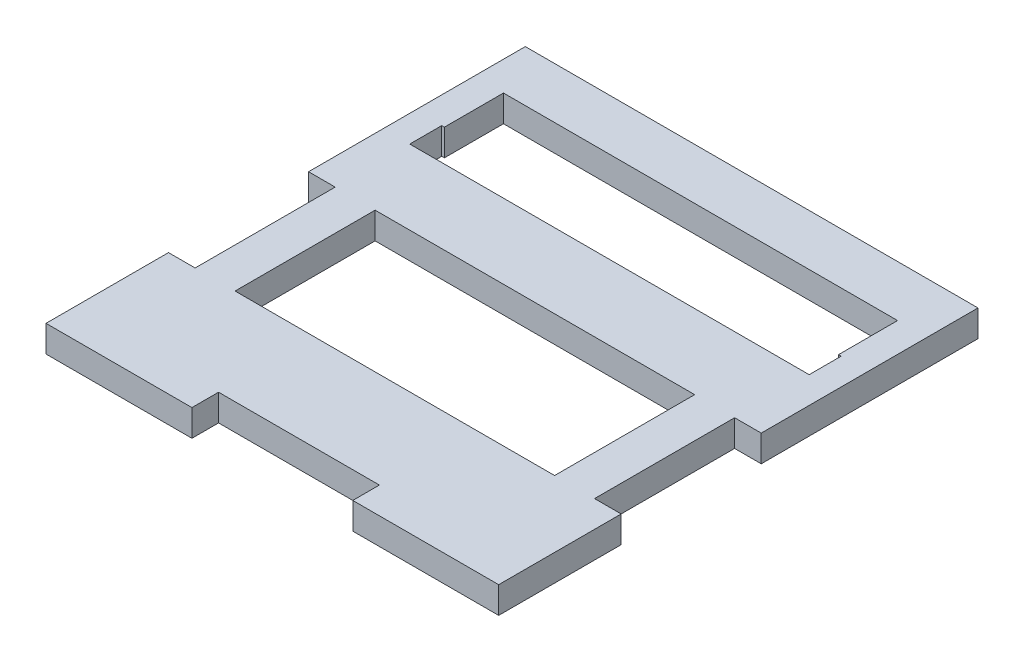
ISO-10303-21;
HEADER;
FILE_DESCRIPTION(('STEP AP214'),'2;1');
FILE_NAME('part.step','',(''),(''),'','','');
FILE_SCHEMA(('AUTOMOTIVE_DESIGN { 1 0 10303 214 1 1 1 1 }'));
ENDSEC;
DATA;
#1=APPLICATION_CONTEXT('core data for automotive mechanical design processes');
#2=APPLICATION_PROTOCOL_DEFINITION('international standard','automotive_design',2000,#1);
#3=PRODUCT_CONTEXT('',#1,'mechanical');
#4=PRODUCT('Part','Part','',(#3));
#5=PRODUCT_RELATED_PRODUCT_CATEGORY('part','',(#4));
#6=PRODUCT_DEFINITION_FORMATION('','',#4);
#7=PRODUCT_DEFINITION_CONTEXT('part definition',#1,'design');
#8=PRODUCT_DEFINITION('design','',#6,#7);
#9=PRODUCT_DEFINITION_SHAPE('','',#8);
#10=(LENGTH_UNIT() NAMED_UNIT(*) SI_UNIT(.MILLI.,.METRE.));
#11=(NAMED_UNIT(*) PLANE_ANGLE_UNIT() SI_UNIT($,.RADIAN.));
#12=(NAMED_UNIT(*) SI_UNIT($,.STERADIAN.) SOLID_ANGLE_UNIT());
#13=UNCERTAINTY_MEASURE_WITH_UNIT(LENGTH_MEASURE(1.E-05),#10,'distance_accuracy_value','');
#14=(GEOMETRIC_REPRESENTATION_CONTEXT(3) GLOBAL_UNCERTAINTY_ASSIGNED_CONTEXT((#13)) GLOBAL_UNIT_ASSIGNED_CONTEXT((#10,
#11,#12)) REPRESENTATION_CONTEXT('',''));
#15=CARTESIAN_POINT('',(0.,0.,0.));
#16=DIRECTION('',(0.,0.,1.));
#17=DIRECTION('',(1.,0.,0.));
#18=AXIS2_PLACEMENT_3D('',#15,#16,#17);
#19=CARTESIAN_POINT('',(-42.5,5.,45.));
#20=DIRECTION('',(0.,0.,-1.));
#21=DIRECTION('',(-1.,0.,0.));
#22=AXIS2_PLACEMENT_3D('',#19,#20,#21);
#23=PLANE('',#22);
#24=DIRECTION('',(0.,1.,0.));
#25=VECTOR('',#24,1.);
#26=CARTESIAN_POINT('',(15.1,0.,45.));
#27=LINE('',#26,#25);
#28=CARTESIAN_POINT('',(15.1,0.,45.));
#29=VERTEX_POINT('',#28);
#30=CARTESIAN_POINT('',(15.1,5.,45.));
#31=VERTEX_POINT('',#30);
#32=EDGE_CURVE('E255',#29,#31,#27,.T.);
#33=ORIENTED_EDGE('',*,*,#32,.F.);
#34=DIRECTION('',(1.,0.,0.));
#35=VECTOR('',#34,1.);
#36=CARTESIAN_POINT('',(-42.5,0.,45.));
#37=LINE('',#36,#35);
#38=CARTESIAN_POINT('',(42.5,0.,45.));
#39=VERTEX_POINT('',#38);
#40=EDGE_CURVE('E243',#29,#39,#37,.T.);
#41=ORIENTED_EDGE('',*,*,#40,.T.);
#42=DIRECTION('',(0.,-1.,0.));
#43=VECTOR('',#42,1.);
#44=CARTESIAN_POINT('',(42.5,5.,45.));
#45=LINE('',#44,#43);
#46=CARTESIAN_POINT('',(42.5,5.,45.));
#47=VERTEX_POINT('',#46);
#48=EDGE_CURVE('E362',#47,#39,#45,.T.);
#49=ORIENTED_EDGE('',*,*,#48,.F.);
#50=DIRECTION('',(1.,0.,0.));
#51=VECTOR('',#50,1.);
#52=CARTESIAN_POINT('',(-42.5,5.,45.));
#53=LINE('',#52,#51);
#54=EDGE_CURVE('E363',#31,#47,#53,.T.);
#55=ORIENTED_EDGE('',*,*,#54,.F.);
#56=EDGE_LOOP('',(#33,#41,#49,#55));
#57=FACE_BOUND('',#56,.T.);
#58=ADVANCED_FACE('F39',(#57),#23,.F.);
#59=CARTESIAN_POINT('',(0.,5.,0.));
#60=DIRECTION('',(0.,-1.,0.));
#61=DIRECTION('',(0.,0.,-1.));
#62=AXIS2_PLACEMENT_3D('',#59,#60,#61);
#63=PLANE('',#62);
#64=DIRECTION('',(1.,0.,0.));
#65=VECTOR('',#64,1.);
#66=CARTESIAN_POINT('',(-37.5,5.,-18.3));
#67=LINE('',#66,#65);
#68=CARTESIAN_POINT('',(-37.5,5.,-18.3));
#69=VERTEX_POINT('',#68);
#70=CARTESIAN_POINT('',(37.5,5.,-18.3));
#71=VERTEX_POINT('',#70);
#72=EDGE_CURVE('E350',#69,#71,#67,.T.);
#73=ORIENTED_EDGE('',*,*,#72,.F.);
#74=DIRECTION('',(0.,0.,1.));
#75=VECTOR('',#74,1.);
#76=CARTESIAN_POINT('',(-37.5,5.,-18.3));
#77=LINE('',#76,#75);
#78=CARTESIAN_POINT('',(-37.5,5.,-24.3));
#79=VERTEX_POINT('',#78);
#80=EDGE_CURVE('E295',#79,#69,#77,.T.);
#81=ORIENTED_EDGE('',*,*,#80,.F.);
#82=DIRECTION('',(-1.,0.,0.));
#83=VECTOR('',#82,1.);
#84=CARTESIAN_POINT('',(-37.5,5.,-24.3));
#85=LINE('',#84,#83);
#86=CARTESIAN_POINT('',(-37.,5.,-24.3));
#87=VERTEX_POINT('',#86);
#88=EDGE_CURVE('E317',#87,#79,#85,.T.);
#89=ORIENTED_EDGE('',*,*,#88,.F.);
#90=DIRECTION('',(0.,0.,1.));
#91=VECTOR('',#90,1.);
#92=CARTESIAN_POINT('',(-37.,5.,-35.4));
#93=LINE('',#92,#91);
#94=CARTESIAN_POINT('',(-37.,5.,-35.4));
#95=VERTEX_POINT('',#94);
#96=EDGE_CURVE('E335',#95,#87,#93,.T.);
#97=ORIENTED_EDGE('',*,*,#96,.F.);
#98=DIRECTION('',(-1.,0.,0.));
#99=VECTOR('',#98,1.);
#100=CARTESIAN_POINT('',(-37.,5.,-35.4));
#101=LINE('',#100,#99);
#102=CARTESIAN_POINT('',(37.,5.,-35.4));
#103=VERTEX_POINT('',#102);
#104=EDGE_CURVE('E334',#103,#95,#101,.T.);
#105=ORIENTED_EDGE('',*,*,#104,.F.);
#106=DIRECTION('',(0.,0.,-1.));
#107=VECTOR('',#106,1.);
#108=CARTESIAN_POINT('',(37.,5.,-35.4));
#109=LINE('',#108,#107);
#110=CARTESIAN_POINT('',(37.,5.,-24.3));
#111=VERTEX_POINT('',#110);
#112=EDGE_CURVE('E336',#111,#103,#109,.T.);
#113=ORIENTED_EDGE('',*,*,#112,.F.);
#114=DIRECTION('',(-1.,0.,0.));
#115=VECTOR('',#114,1.);
#116=CARTESIAN_POINT('',(37.5,5.,-24.3));
#117=LINE('',#116,#115);
#118=CARTESIAN_POINT('',(37.5,5.,-24.3));
#119=VERTEX_POINT('',#118);
#120=EDGE_CURVE('E342',#119,#111,#117,.T.);
#121=ORIENTED_EDGE('',*,*,#120,.F.);
#122=DIRECTION('',(0.,0.,-1.));
#123=VECTOR('',#122,1.);
#124=CARTESIAN_POINT('',(37.5,5.,-18.3));
#125=LINE('',#124,#123);
#126=EDGE_CURVE('E341',#71,#119,#125,.T.);
#127=ORIENTED_EDGE('',*,*,#126,.F.);
#128=EDGE_LOOP('',(#73,#81,#89,#97,#105,#113,#121,#127));
#129=FACE_BOUND('',#128,.T.);
#130=DIRECTION('',(-1.,0.,0.));
#131=VECTOR('',#130,1.);
#132=CARTESIAN_POINT('',(-30.,5.,-4.3));
#133=LINE('',#132,#131);
#134=CARTESIAN_POINT('',(30.,5.,-4.3));
#135=VERTEX_POINT('',#134);
#136=CARTESIAN_POINT('',(-30.,5.,-4.3));
#137=VERTEX_POINT('',#136);
#138=EDGE_CURVE('E291',#135,#137,#133,.T.);
#139=ORIENTED_EDGE('',*,*,#138,.F.);
#140=DIRECTION('',(0.,0.,-1.));
#141=VECTOR('',#140,1.);
#142=CARTESIAN_POINT('',(30.,5.,22.));
#143=LINE('',#142,#141);
#144=CARTESIAN_POINT('',(30.,5.,22.));
#145=VERTEX_POINT('',#144);
#146=EDGE_CURVE('E293',#145,#135,#143,.T.);
#147=ORIENTED_EDGE('',*,*,#146,.F.);
#148=DIRECTION('',(1.,0.,0.));
#149=VECTOR('',#148,1.);
#150=CARTESIAN_POINT('',(-30.,5.,22.));
#151=LINE('',#150,#149);
#152=CARTESIAN_POINT('',(-30.,5.,22.));
#153=VERTEX_POINT('',#152);
#154=EDGE_CURVE('E297',#153,#145,#151,.T.);
#155=ORIENTED_EDGE('',*,*,#154,.F.);
#156=DIRECTION('',(0.,0.,1.));
#157=VECTOR('',#156,1.);
#158=CARTESIAN_POINT('',(-30.,5.,22.));
#159=LINE('',#158,#157);
#160=EDGE_CURVE('E300',#137,#153,#159,.T.);
#161=ORIENTED_EDGE('',*,*,#160,.F.);
#162=EDGE_LOOP('',(#139,#147,#155,#161));
#163=FACE_BOUND('',#162,.T.);
#164=DIRECTION('',(0.,0.,-1.));
#165=VECTOR('',#164,1.);
#166=CARTESIAN_POINT('',(15.1,5.,40.));
#167=LINE('',#166,#165);
#168=CARTESIAN_POINT('',(15.1,5.,40.));
#169=VERTEX_POINT('',#168);
#170=EDGE_CURVE('E230',#31,#169,#167,.T.);
#171=ORIENTED_EDGE('',*,*,#170,.F.);
#172=ORIENTED_EDGE('',*,*,#54,.T.);
#173=DIRECTION('',(0.,0.,-1.));
#174=VECTOR('',#173,1.);
#175=CARTESIAN_POINT('',(42.5,5.,45.));
#176=LINE('',#175,#174);
#177=CARTESIAN_POINT('',(42.5,5.,22.));
#178=VERTEX_POINT('',#177);
#179=EDGE_CURVE('E353',#47,#178,#176,.T.);
#180=ORIENTED_EDGE('',*,*,#179,.T.);
#181=DIRECTION('',(1.,0.,0.));
#182=VECTOR('',#181,1.);
#183=CARTESIAN_POINT('',(37.5,5.,22.));
#184=LINE('',#183,#182);
#185=CARTESIAN_POINT('',(37.5,5.,22.));
#186=VERTEX_POINT('',#185);
#187=EDGE_CURVE('E279',#186,#178,#184,.T.);
#188=ORIENTED_EDGE('',*,*,#187,.F.);
#189=DIRECTION('',(0.,0.,1.));
#190=VECTOR('',#189,1.);
#191=CARTESIAN_POINT('',(37.5,5.,-4.30000000000001));
#192=LINE('',#191,#190);
#193=CARTESIAN_POINT('',(37.5,5.,-4.30000000000001));
#194=VERTEX_POINT('',#193);
#195=EDGE_CURVE('E288',#194,#186,#192,.T.);
#196=ORIENTED_EDGE('',*,*,#195,.F.);
#197=DIRECTION('',(-1.,0.,0.));
#198=VECTOR('',#197,1.);
#199=CARTESIAN_POINT('',(42.5,5.,-4.30000000000001));
#200=LINE('',#199,#198);
#201=CARTESIAN_POINT('',(42.5,5.,-4.30000000000001));
#202=VERTEX_POINT('',#201);
#203=EDGE_CURVE('E265',#202,#194,#200,.T.);
#204=ORIENTED_EDGE('',*,*,#203,.F.);
#205=CARTESIAN_POINT('',(42.5,5.,-45.));
#206=VERTEX_POINT('',#205);
#207=EDGE_CURVE('E354',#202,#206,#176,.T.);
#208=ORIENTED_EDGE('',*,*,#207,.T.);
#209=DIRECTION('',(-1.,0.,0.));
#210=VECTOR('',#209,1.);
#211=CARTESIAN_POINT('',(-42.5,5.,-45.));
#212=LINE('',#211,#210);
#213=CARTESIAN_POINT('',(-42.5,5.,-45.));
#214=VERTEX_POINT('',#213);
#215=EDGE_CURVE('E352',#206,#214,#212,.T.);
#216=ORIENTED_EDGE('',*,*,#215,.T.);
#217=DIRECTION('',(0.,0.,1.));
#218=VECTOR('',#217,1.);
#219=CARTESIAN_POINT('',(-42.5,5.,45.));
#220=LINE('',#219,#218);
#221=CARTESIAN_POINT('',(-42.5,5.,-4.30000000000001));
#222=VERTEX_POINT('',#221);
#223=EDGE_CURVE('E356',#214,#222,#220,.T.);
#224=ORIENTED_EDGE('',*,*,#223,.T.);
#225=DIRECTION('',(-1.,0.,0.));
#226=VECTOR('',#225,1.);
#227=CARTESIAN_POINT('',(-42.5,5.,-4.30000000000001));
#228=LINE('',#227,#226);
#229=CARTESIAN_POINT('',(-37.5,5.,-4.30000000000001));
#230=VERTEX_POINT('',#229);
#231=EDGE_CURVE('E264',#230,#222,#228,.T.);
#232=ORIENTED_EDGE('',*,*,#231,.F.);
#233=DIRECTION('',(0.,0.,-1.));
#234=VECTOR('',#233,1.);
#235=CARTESIAN_POINT('',(-37.5,5.,-4.30000000000001));
#236=LINE('',#235,#234);
#237=CARTESIAN_POINT('',(-37.5,5.,22.));
#238=VERTEX_POINT('',#237);
#239=EDGE_CURVE('E261',#238,#230,#236,.T.);
#240=ORIENTED_EDGE('',*,*,#239,.F.);
#241=DIRECTION('',(1.,0.,0.));
#242=VECTOR('',#241,1.);
#243=CARTESIAN_POINT('',(-37.5,5.,22.));
#244=LINE('',#243,#242);
#245=CARTESIAN_POINT('',(-42.5,5.,22.));
#246=VERTEX_POINT('',#245);
#247=EDGE_CURVE('E256',#246,#238,#244,.T.);
#248=ORIENTED_EDGE('',*,*,#247,.F.);
#249=CARTESIAN_POINT('',(-42.5,5.,45.));
#250=VERTEX_POINT('',#249);
#251=EDGE_CURVE('E357',#246,#250,#220,.T.);
#252=ORIENTED_EDGE('',*,*,#251,.T.);
#253=CARTESIAN_POINT('',(-15.1,5.,45.));
#254=VERTEX_POINT('',#253);
#255=EDGE_CURVE('E365',#250,#254,#53,.T.);
#256=ORIENTED_EDGE('',*,*,#255,.T.);
#257=DIRECTION('',(0.,0.,1.));
#258=VECTOR('',#257,1.);
#259=CARTESIAN_POINT('',(-15.1,5.,40.));
#260=LINE('',#259,#258);
#261=CARTESIAN_POINT('',(-15.1,5.,40.));
#262=VERTEX_POINT('',#261);
#263=EDGE_CURVE('E242',#262,#254,#260,.T.);
#264=ORIENTED_EDGE('',*,*,#263,.F.);
#265=DIRECTION('',(-1.,0.,0.));
#266=VECTOR('',#265,1.);
#267=CARTESIAN_POINT('',(-15.1,5.,40.));
#268=LINE('',#267,#266);
#269=EDGE_CURVE('E246',#169,#262,#268,.T.);
#270=ORIENTED_EDGE('',*,*,#269,.F.);
#271=EDGE_LOOP('',(#171,#172,#180,#188,#196,#204,#208,#216,#224,#232,#240,#248,#252,#256,#264,#270));
#272=FACE_BOUND('',#271,.T.);
#273=ADVANCED_FACE('F439',(#129,#163,#272),#63,.F.);
#274=CARTESIAN_POINT('',(0.,0.,0.));
#275=DIRECTION('',(0.,-1.,0.));
#276=DIRECTION('',(0.,0.,-1.));
#277=AXIS2_PLACEMENT_3D('',#274,#275,#276);
#278=PLANE('',#277);
#279=DIRECTION('',(0.,0.,1.));
#280=VECTOR('',#279,1.);
#281=CARTESIAN_POINT('',(30.,0.,0.));
#282=LINE('',#281,#280);
#283=CARTESIAN_POINT('',(30.,0.,-4.3));
#284=VERTEX_POINT('',#283);
#285=CARTESIAN_POINT('',(30.,0.,22.));
#286=VERTEX_POINT('',#285);
#287=EDGE_CURVE('E412',#284,#286,#282,.T.);
#288=ORIENTED_EDGE('',*,*,#287,.F.);
#289=DIRECTION('',(1.,0.,0.));
#290=VECTOR('',#289,1.);
#291=CARTESIAN_POINT('',(0.,0.,-4.3));
#292=LINE('',#291,#290);
#293=CARTESIAN_POINT('',(-30.,0.,-4.3));
#294=VERTEX_POINT('',#293);
#295=EDGE_CURVE('E407',#294,#284,#292,.T.);
#296=ORIENTED_EDGE('',*,*,#295,.F.);
#297=DIRECTION('',(0.,0.,-1.));
#298=VECTOR('',#297,1.);
#299=CARTESIAN_POINT('',(-30.,0.,0.));
#300=LINE('',#299,#298);
#301=CARTESIAN_POINT('',(-30.,0.,22.));
#302=VERTEX_POINT('',#301);
#303=EDGE_CURVE('E409',#302,#294,#300,.T.);
#304=ORIENTED_EDGE('',*,*,#303,.F.);
#305=DIRECTION('',(-1.,0.,0.));
#306=VECTOR('',#305,1.);
#307=CARTESIAN_POINT('',(0.,0.,22.));
#308=LINE('',#307,#306);
#309=EDGE_CURVE('E411',#286,#302,#308,.T.);
#310=ORIENTED_EDGE('',*,*,#309,.F.);
#311=EDGE_LOOP('',(#288,#296,#304,#310));
#312=FACE_BOUND('',#311,.T.);
#313=DIRECTION('',(0.,0.,-1.));
#314=VECTOR('',#313,1.);
#315=CARTESIAN_POINT('',(-37.5,0.,0.));
#316=LINE('',#315,#314);
#317=CARTESIAN_POINT('',(-37.5,0.,-18.3));
#318=VERTEX_POINT('',#317);
#319=CARTESIAN_POINT('',(-37.5,0.,-24.3));
#320=VERTEX_POINT('',#319);
#321=EDGE_CURVE('E404',#318,#320,#316,.T.);
#322=ORIENTED_EDGE('',*,*,#321,.F.);
#323=DIRECTION('',(-1.,0.,0.));
#324=VECTOR('',#323,1.);
#325=CARTESIAN_POINT('',(0.,0.,-18.3));
#326=LINE('',#325,#324);
#327=CARTESIAN_POINT('',(37.5,0.,-18.3));
#328=VERTEX_POINT('',#327);
#329=EDGE_CURVE('E386',#328,#318,#326,.T.);
#330=ORIENTED_EDGE('',*,*,#329,.F.);
#331=DIRECTION('',(0.,0.,1.));
#332=VECTOR('',#331,1.);
#333=CARTESIAN_POINT('',(37.5,0.,0.));
#334=LINE('',#333,#332);
#335=CARTESIAN_POINT('',(37.5,0.,-24.3));
#336=VERTEX_POINT('',#335);
#337=EDGE_CURVE('E391',#336,#328,#334,.T.);
#338=ORIENTED_EDGE('',*,*,#337,.F.);
#339=DIRECTION('',(1.,0.,0.));
#340=VECTOR('',#339,1.);
#341=CARTESIAN_POINT('',(0.,0.,-24.3));
#342=LINE('',#341,#340);
#343=CARTESIAN_POINT('',(37.,0.,-24.3));
#344=VERTEX_POINT('',#343);
#345=EDGE_CURVE('E393',#344,#336,#342,.T.);
#346=ORIENTED_EDGE('',*,*,#345,.F.);
#347=DIRECTION('',(0.,0.,1.));
#348=VECTOR('',#347,1.);
#349=CARTESIAN_POINT('',(37.,0.,0.));
#350=LINE('',#349,#348);
#351=CARTESIAN_POINT('',(37.,0.,-35.4));
#352=VERTEX_POINT('',#351);
#353=EDGE_CURVE('E398',#352,#344,#350,.T.);
#354=ORIENTED_EDGE('',*,*,#353,.F.);
#355=DIRECTION('',(1.,0.,0.));
#356=VECTOR('',#355,1.);
#357=CARTESIAN_POINT('',(0.,0.,-35.4));
#358=LINE('',#357,#356);
#359=CARTESIAN_POINT('',(-37.,0.,-35.4));
#360=VERTEX_POINT('',#359);
#361=EDGE_CURVE('E396',#360,#352,#358,.T.);
#362=ORIENTED_EDGE('',*,*,#361,.F.);
#363=DIRECTION('',(0.,0.,-1.));
#364=VECTOR('',#363,1.);
#365=CARTESIAN_POINT('',(-37.,0.,0.));
#366=LINE('',#365,#364);
#367=CARTESIAN_POINT('',(-37.,0.,-24.3));
#368=VERTEX_POINT('',#367);
#369=EDGE_CURVE('E399',#368,#360,#366,.T.);
#370=ORIENTED_EDGE('',*,*,#369,.F.);
#371=DIRECTION('',(1.,0.,0.));
#372=VECTOR('',#371,1.);
#373=CARTESIAN_POINT('',(0.,0.,-24.3));
#374=LINE('',#373,#372);
#375=EDGE_CURVE('E405',#320,#368,#374,.T.);
#376=ORIENTED_EDGE('',*,*,#375,.F.);
#377=EDGE_LOOP('',(#322,#330,#338,#346,#354,#362,#370,#376));
#378=FACE_BOUND('',#377,.T.);
#379=ORIENTED_EDGE('',*,*,#40,.F.);
#380=DIRECTION('',(0.,0.,-1.));
#381=VECTOR('',#380,1.);
#382=CARTESIAN_POINT('',(15.1,0.,40.));
#383=LINE('',#382,#381);
#384=CARTESIAN_POINT('',(15.1,0.,40.));
#385=VERTEX_POINT('',#384);
#386=EDGE_CURVE('E228',#29,#385,#383,.T.);
#387=ORIENTED_EDGE('',*,*,#386,.T.);
#388=DIRECTION('',(-1.,0.,0.));
#389=VECTOR('',#388,1.);
#390=CARTESIAN_POINT('',(-15.1,0.,40.));
#391=LINE('',#390,#389);
#392=CARTESIAN_POINT('',(-15.1,0.,40.));
#393=VERTEX_POINT('',#392);
#394=EDGE_CURVE('E236',#385,#393,#391,.T.);
#395=ORIENTED_EDGE('',*,*,#394,.T.);
#396=DIRECTION('',(0.,0.,1.));
#397=VECTOR('',#396,1.);
#398=CARTESIAN_POINT('',(-15.1,0.,40.));
#399=LINE('',#398,#397);
#400=CARTESIAN_POINT('',(-15.1,0.,45.));
#401=VERTEX_POINT('',#400);
#402=EDGE_CURVE('E53',#393,#401,#399,.T.);
#403=ORIENTED_EDGE('',*,*,#402,.T.);
#404=CARTESIAN_POINT('',(-42.5,0.,45.));
#405=VERTEX_POINT('',#404);
#406=EDGE_CURVE('E374',#405,#401,#37,.T.);
#407=ORIENTED_EDGE('',*,*,#406,.F.);
#408=DIRECTION('',(0.,0.,1.));
#409=VECTOR('',#408,1.);
#410=CARTESIAN_POINT('',(-42.5,0.,45.));
#411=LINE('',#410,#409);
#412=CARTESIAN_POINT('',(-42.5,0.,22.));
#413=VERTEX_POINT('',#412);
#414=EDGE_CURVE('E371',#413,#405,#411,.T.);
#415=ORIENTED_EDGE('',*,*,#414,.F.);
#416=DIRECTION('',(-1.,0.,0.));
#417=VECTOR('',#416,1.);
#418=CARTESIAN_POINT('',(0.,0.,22.));
#419=LINE('',#418,#417);
#420=CARTESIAN_POINT('',(-37.5,0.,22.));
#421=VERTEX_POINT('',#420);
#422=EDGE_CURVE('E422',#421,#413,#419,.T.);
#423=ORIENTED_EDGE('',*,*,#422,.F.);
#424=DIRECTION('',(0.,0.,1.));
#425=VECTOR('',#424,1.);
#426=CARTESIAN_POINT('',(-37.5,0.,0.));
#427=LINE('',#426,#425);
#428=CARTESIAN_POINT('',(-37.5,0.,-4.30000000000001));
#429=VERTEX_POINT('',#428);
#430=EDGE_CURVE('E50',#429,#421,#427,.T.);
#431=ORIENTED_EDGE('',*,*,#430,.F.);
#432=DIRECTION('',(1.,0.,0.));
#433=VECTOR('',#432,1.);
#434=CARTESIAN_POINT('',(0.,0.,-4.30000000000001));
#435=LINE('',#434,#433);
#436=CARTESIAN_POINT('',(-42.5,0.,-4.30000000000001));
#437=VERTEX_POINT('',#436);
#438=EDGE_CURVE('E11',#437,#429,#435,.T.);
#439=ORIENTED_EDGE('',*,*,#438,.F.);
#440=CARTESIAN_POINT('',(-42.5,0.,-45.));
#441=VERTEX_POINT('',#440);
#442=EDGE_CURVE('E375',#441,#437,#411,.T.);
#443=ORIENTED_EDGE('',*,*,#442,.F.);
#444=DIRECTION('',(-1.,0.,0.));
#445=VECTOR('',#444,1.);
#446=CARTESIAN_POINT('',(-42.5,0.,-45.));
#447=LINE('',#446,#445);
#448=CARTESIAN_POINT('',(42.5,0.,-45.));
#449=VERTEX_POINT('',#448);
#450=EDGE_CURVE('E367',#449,#441,#447,.T.);
#451=ORIENTED_EDGE('',*,*,#450,.F.);
#452=DIRECTION('',(0.,0.,-1.));
#453=VECTOR('',#452,1.);
#454=CARTESIAN_POINT('',(42.5,0.,45.));
#455=LINE('',#454,#453);
#456=CARTESIAN_POINT('',(42.5,0.,-4.30000000000001));
#457=VERTEX_POINT('',#456);
#458=EDGE_CURVE('E306',#457,#449,#455,.T.);
#459=ORIENTED_EDGE('',*,*,#458,.F.);
#460=DIRECTION('',(1.,0.,0.));
#461=VECTOR('',#460,1.);
#462=CARTESIAN_POINT('',(0.,0.,-4.30000000000001));
#463=LINE('',#462,#461);
#464=CARTESIAN_POINT('',(37.5,0.,-4.30000000000001));
#465=VERTEX_POINT('',#464);
#466=EDGE_CURVE('E419',#465,#457,#463,.T.);
#467=ORIENTED_EDGE('',*,*,#466,.F.);
#468=DIRECTION('',(0.,0.,-1.));
#469=VECTOR('',#468,1.);
#470=CARTESIAN_POINT('',(37.5,0.,0.));
#471=LINE('',#470,#469);
#472=CARTESIAN_POINT('',(37.5,0.,22.));
#473=VERTEX_POINT('',#472);
#474=EDGE_CURVE('E414',#473,#465,#471,.T.);
#475=ORIENTED_EDGE('',*,*,#474,.F.);
#476=DIRECTION('',(-1.,0.,0.));
#477=VECTOR('',#476,1.);
#478=CARTESIAN_POINT('',(0.,0.,22.));
#479=LINE('',#478,#477);
#480=CARTESIAN_POINT('',(42.5,0.,22.));
#481=VERTEX_POINT('',#480);
#482=EDGE_CURVE('E420',#481,#473,#479,.T.);
#483=ORIENTED_EDGE('',*,*,#482,.F.);
#484=EDGE_CURVE('E366',#39,#481,#455,.T.);
#485=ORIENTED_EDGE('',*,*,#484,.F.);
#486=EDGE_LOOP('',(#379,#387,#395,#403,#407,#415,#423,#431,#439,#443,#451,#459,#467,#475,#483,#485));
#487=FACE_BOUND('',#486,.T.);
#488=ADVANCED_FACE('F241',(#312,#378,#487),#278,.T.);
#489=CARTESIAN_POINT('',(42.5,5.,45.));
#490=DIRECTION('',(-1.,0.,0.));
#491=DIRECTION('',(0.,0.,1.));
#492=AXIS2_PLACEMENT_3D('',#489,#490,#491);
#493=PLANE('',#492);
#494=DIRECTION('',(0.,1.,0.));
#495=VECTOR('',#494,1.);
#496=CARTESIAN_POINT('',(42.5,-2.5,-4.30000000000001));
#497=LINE('',#496,#495);
#498=EDGE_CURVE('E251',#457,#202,#497,.T.);
#499=ORIENTED_EDGE('',*,*,#498,.F.);
#500=ORIENTED_EDGE('',*,*,#458,.T.);
#501=DIRECTION('',(0.,-1.,0.));
#502=VECTOR('',#501,1.);
#503=CARTESIAN_POINT('',(42.5,5.,-45.));
#504=LINE('',#503,#502);
#505=EDGE_CURVE('E387',#206,#449,#504,.T.);
#506=ORIENTED_EDGE('',*,*,#505,.F.);
#507=ORIENTED_EDGE('',*,*,#207,.F.);
#508=EDGE_LOOP('',(#499,#500,#506,#507));
#509=FACE_BOUND('',#508,.T.);
#510=ADVANCED_FACE('F463',(#509),#493,.F.);
#511=CARTESIAN_POINT('',(-42.5,5.,45.));
#512=DIRECTION('',(1.,0.,0.));
#513=DIRECTION('',(0.,0.,-1.));
#514=AXIS2_PLACEMENT_3D('',#511,#512,#513);
#515=PLANE('',#514);
#516=DIRECTION('',(0.,1.,0.));
#517=VECTOR('',#516,1.);
#518=CARTESIAN_POINT('',(-42.5,-2.5,22.));
#519=LINE('',#518,#517);
#520=EDGE_CURVE('E270',#413,#246,#519,.T.);
#521=ORIENTED_EDGE('',*,*,#520,.F.);
#522=ORIENTED_EDGE('',*,*,#414,.T.);
#523=DIRECTION('',(0.,-1.,0.));
#524=VECTOR('',#523,1.);
#525=CARTESIAN_POINT('',(-42.5,5.,45.));
#526=LINE('',#525,#524);
#527=EDGE_CURVE('E379',#250,#405,#526,.T.);
#528=ORIENTED_EDGE('',*,*,#527,.F.);
#529=ORIENTED_EDGE('',*,*,#251,.F.);
#530=EDGE_LOOP('',(#521,#522,#528,#529));
#531=FACE_BOUND('',#530,.T.);
#532=ADVANCED_FACE('F436',(#531),#515,.F.);
#533=ORIENTED_EDGE('',*,*,#484,.T.);
#534=DIRECTION('',(0.,1.,0.));
#535=VECTOR('',#534,1.);
#536=CARTESIAN_POINT('',(42.5,-2.5,22.));
#537=LINE('',#536,#535);
#538=EDGE_CURVE('E281',#481,#178,#537,.T.);
#539=ORIENTED_EDGE('',*,*,#538,.T.);
#540=ORIENTED_EDGE('',*,*,#179,.F.);
#541=ORIENTED_EDGE('',*,*,#48,.T.);
#542=EDGE_LOOP('',(#533,#539,#540,#541));
#543=FACE_BOUND('',#542,.T.);
#544=ADVANCED_FACE('F41',(#543),#493,.F.);
#545=CARTESIAN_POINT('',(-42.5,5.,-45.));
#546=DIRECTION('',(0.,0.,1.));
#547=DIRECTION('',(1.,0.,0.));
#548=AXIS2_PLACEMENT_3D('',#545,#546,#547);
#549=PLANE('',#548);
#550=ORIENTED_EDGE('',*,*,#450,.T.);
#551=DIRECTION('',(0.,-1.,0.));
#552=VECTOR('',#551,1.);
#553=CARTESIAN_POINT('',(-42.5,5.,-45.));
#554=LINE('',#553,#552);
#555=EDGE_CURVE('E384',#214,#441,#554,.T.);
#556=ORIENTED_EDGE('',*,*,#555,.F.);
#557=ORIENTED_EDGE('',*,*,#215,.F.);
#558=ORIENTED_EDGE('',*,*,#505,.T.);
#559=EDGE_LOOP('',(#550,#556,#557,#558));
#560=FACE_BOUND('',#559,.T.);
#561=ADVANCED_FACE('F460',(#560),#549,.F.);
#562=ORIENTED_EDGE('',*,*,#442,.T.);
#563=DIRECTION('',(0.,1.,0.));
#564=VECTOR('',#563,1.);
#565=CARTESIAN_POINT('',(-42.5,-2.5,-4.30000000000001));
#566=LINE('',#565,#564);
#567=EDGE_CURVE('E266',#437,#222,#566,.T.);
#568=ORIENTED_EDGE('',*,*,#567,.T.);
#569=ORIENTED_EDGE('',*,*,#223,.F.);
#570=ORIENTED_EDGE('',*,*,#555,.T.);
#571=EDGE_LOOP('',(#562,#568,#569,#570));
#572=FACE_BOUND('',#571,.T.);
#573=ADVANCED_FACE('F449',(#572),#515,.F.);
#574=ORIENTED_EDGE('',*,*,#406,.T.);
#575=DIRECTION('',(0.,1.,0.));
#576=VECTOR('',#575,1.);
#577=CARTESIAN_POINT('',(-15.1,0.,45.));
#578=LINE('',#577,#576);
#579=EDGE_CURVE('E253',#401,#254,#578,.T.);
#580=ORIENTED_EDGE('',*,*,#579,.T.);
#581=ORIENTED_EDGE('',*,*,#255,.F.);
#582=ORIENTED_EDGE('',*,*,#527,.T.);
#583=EDGE_LOOP('',(#574,#580,#581,#582));
#584=FACE_BOUND('',#583,.T.);
#585=ADVANCED_FACE('F479',(#584),#23,.F.);
#586=CARTESIAN_POINT('',(-37.5,-2.5,-18.3));
#587=DIRECTION('',(-1.,0.,0.));
#588=DIRECTION('',(0.,0.,1.));
#589=AXIS2_PLACEMENT_3D('',#586,#587,#588);
#590=PLANE('',#589);
#591=ORIENTED_EDGE('',*,*,#321,.T.);
#592=DIRECTION('',(0.,1.,0.));
#593=VECTOR('',#592,1.);
#594=CARTESIAN_POINT('',(-37.5,-2.5,-24.3));
#595=LINE('',#594,#593);
#596=EDGE_CURVE('E272',#320,#79,#595,.T.);
#597=ORIENTED_EDGE('',*,*,#596,.T.);
#598=ORIENTED_EDGE('',*,*,#80,.T.);
#599=DIRECTION('',(0.,1.,0.));
#600=VECTOR('',#599,1.);
#601=CARTESIAN_POINT('',(-37.5,-2.5,-18.3));
#602=LINE('',#601,#600);
#603=EDGE_CURVE('E312',#318,#69,#602,.T.);
#604=ORIENTED_EDGE('',*,*,#603,.F.);
#605=EDGE_LOOP('',(#591,#597,#598,#604));
#606=FACE_BOUND('',#605,.T.);
#607=ADVANCED_FACE('F485',(#606),#590,.F.);
#608=CARTESIAN_POINT('',(-37.5,-2.5,-24.3));
#609=DIRECTION('',(0.,0.,-1.));
#610=DIRECTION('',(-1.,0.,0.));
#611=AXIS2_PLACEMENT_3D('',#608,#609,#610);
#612=PLANE('',#611);
#613=ORIENTED_EDGE('',*,*,#375,.T.);
#614=DIRECTION('',(0.,1.,0.));
#615=VECTOR('',#614,1.);
#616=CARTESIAN_POINT('',(-37.,-2.5,-24.3));
#617=LINE('',#616,#615);
#618=EDGE_CURVE('E330',#368,#87,#617,.T.);
#619=ORIENTED_EDGE('',*,*,#618,.T.);
#620=ORIENTED_EDGE('',*,*,#88,.T.);
#621=ORIENTED_EDGE('',*,*,#596,.F.);
#622=EDGE_LOOP('',(#613,#619,#620,#621));
#623=FACE_BOUND('',#622,.T.);
#624=ADVANCED_FACE('F490',(#623),#612,.F.);
#625=CARTESIAN_POINT('',(-37.,-2.5,-35.4));
#626=DIRECTION('',(-1.,0.,0.));
#627=DIRECTION('',(0.,0.,1.));
#628=AXIS2_PLACEMENT_3D('',#625,#626,#627);
#629=PLANE('',#628);
#630=ORIENTED_EDGE('',*,*,#369,.T.);
#631=DIRECTION('',(0.,1.,0.));
#632=VECTOR('',#631,1.);
#633=CARTESIAN_POINT('',(-37.,-2.5,-35.4));
#634=LINE('',#633,#632);
#635=EDGE_CURVE('E323',#360,#95,#634,.T.);
#636=ORIENTED_EDGE('',*,*,#635,.T.);
#637=ORIENTED_EDGE('',*,*,#96,.T.);
#638=ORIENTED_EDGE('',*,*,#618,.F.);
#639=EDGE_LOOP('',(#630,#636,#637,#638));
#640=FACE_BOUND('',#639,.T.);
#641=ADVANCED_FACE('F509',(#640),#629,.F.);
#642=CARTESIAN_POINT('',(-37.,-2.5,-35.4));
#643=DIRECTION('',(0.,0.,-1.));
#644=DIRECTION('',(-1.,0.,0.));
#645=AXIS2_PLACEMENT_3D('',#642,#643,#644);
#646=PLANE('',#645);
#647=ORIENTED_EDGE('',*,*,#361,.T.);
#648=DIRECTION('',(0.,1.,0.));
#649=VECTOR('',#648,1.);
#650=CARTESIAN_POINT('',(37.,-2.5,-35.4));
#651=LINE('',#650,#649);
#652=EDGE_CURVE('E324',#352,#103,#651,.T.);
#653=ORIENTED_EDGE('',*,*,#652,.T.);
#654=ORIENTED_EDGE('',*,*,#104,.T.);
#655=ORIENTED_EDGE('',*,*,#635,.F.);
#656=EDGE_LOOP('',(#647,#653,#654,#655));
#657=FACE_BOUND('',#656,.T.);
#658=ADVANCED_FACE('F511',(#657),#646,.F.);
#659=CARTESIAN_POINT('',(37.,-2.5,-35.4));
#660=DIRECTION('',(1.,0.,0.));
#661=DIRECTION('',(0.,0.,-1.));
#662=AXIS2_PLACEMENT_3D('',#659,#660,#661);
#663=PLANE('',#662);
#664=ORIENTED_EDGE('',*,*,#353,.T.);
#665=DIRECTION('',(0.,1.,0.));
#666=VECTOR('',#665,1.);
#667=CARTESIAN_POINT('',(37.,-2.5,-24.3));
#668=LINE('',#667,#666);
#669=EDGE_CURVE('E322',#344,#111,#668,.T.);
#670=ORIENTED_EDGE('',*,*,#669,.T.);
#671=ORIENTED_EDGE('',*,*,#112,.T.);
#672=ORIENTED_EDGE('',*,*,#652,.F.);
#673=EDGE_LOOP('',(#664,#670,#671,#672));
#674=FACE_BOUND('',#673,.T.);
#675=ADVANCED_FACE('F519',(#674),#663,.F.);
#676=CARTESIAN_POINT('',(37.5,-2.5,-24.3));
#677=DIRECTION('',(0.,0.,-1.));
#678=DIRECTION('',(-1.,0.,0.));
#679=AXIS2_PLACEMENT_3D('',#676,#677,#678);
#680=PLANE('',#679);
#681=ORIENTED_EDGE('',*,*,#345,.T.);
#682=DIRECTION('',(0.,1.,0.));
#683=VECTOR('',#682,1.);
#684=CARTESIAN_POINT('',(37.5,-2.5,-24.3));
#685=LINE('',#684,#683);
#686=EDGE_CURVE('E316',#336,#119,#685,.T.);
#687=ORIENTED_EDGE('',*,*,#686,.T.);
#688=ORIENTED_EDGE('',*,*,#120,.T.);
#689=ORIENTED_EDGE('',*,*,#669,.F.);
#690=EDGE_LOOP('',(#681,#687,#688,#689));
#691=FACE_BOUND('',#690,.T.);
#692=ADVANCED_FACE('F525',(#691),#680,.F.);
#693=CARTESIAN_POINT('',(37.5,-2.5,-18.3));
#694=DIRECTION('',(1.,0.,0.));
#695=DIRECTION('',(0.,0.,-1.));
#696=AXIS2_PLACEMENT_3D('',#693,#694,#695);
#697=PLANE('',#696);
#698=ORIENTED_EDGE('',*,*,#337,.T.);
#699=DIRECTION('',(0.,1.,0.));
#700=VECTOR('',#699,1.);
#701=CARTESIAN_POINT('',(37.5,-2.5,-18.3));
#702=LINE('',#701,#700);
#703=EDGE_CURVE('E320',#328,#71,#702,.T.);
#704=ORIENTED_EDGE('',*,*,#703,.T.);
#705=ORIENTED_EDGE('',*,*,#126,.T.);
#706=ORIENTED_EDGE('',*,*,#686,.F.);
#707=EDGE_LOOP('',(#698,#704,#705,#706));
#708=FACE_BOUND('',#707,.T.);
#709=ADVANCED_FACE('F528',(#708),#697,.F.);
#710=CARTESIAN_POINT('',(-37.5,-2.5,-18.3));
#711=DIRECTION('',(0.,0.,1.));
#712=DIRECTION('',(1.,0.,0.));
#713=AXIS2_PLACEMENT_3D('',#710,#711,#712);
#714=PLANE('',#713);
#715=ORIENTED_EDGE('',*,*,#329,.T.);
#716=ORIENTED_EDGE('',*,*,#603,.T.);
#717=ORIENTED_EDGE('',*,*,#72,.T.);
#718=ORIENTED_EDGE('',*,*,#703,.F.);
#719=EDGE_LOOP('',(#715,#716,#717,#718));
#720=FACE_BOUND('',#719,.T.);
#721=ADVANCED_FACE('F529',(#720),#714,.F.);
#722=CARTESIAN_POINT('',(30.,-2.5,22.));
#723=DIRECTION('',(1.,0.,0.));
#724=DIRECTION('',(0.,0.,-1.));
#725=AXIS2_PLACEMENT_3D('',#722,#723,#724);
#726=PLANE('',#725);
#727=ORIENTED_EDGE('',*,*,#287,.T.);
#728=DIRECTION('',(0.,1.,0.));
#729=VECTOR('',#728,1.);
#730=CARTESIAN_POINT('',(30.,-2.5,22.));
#731=LINE('',#730,#729);
#732=EDGE_CURVE('E302',#286,#145,#731,.T.);
#733=ORIENTED_EDGE('',*,*,#732,.T.);
#734=ORIENTED_EDGE('',*,*,#146,.T.);
#735=DIRECTION('',(0.,1.,0.));
#736=VECTOR('',#735,1.);
#737=CARTESIAN_POINT('',(30.,-2.5,-4.3));
#738=LINE('',#737,#736);
#739=EDGE_CURVE('E303',#284,#135,#738,.T.);
#740=ORIENTED_EDGE('',*,*,#739,.F.);
#741=EDGE_LOOP('',(#727,#733,#734,#740));
#742=FACE_BOUND('',#741,.T.);
#743=ADVANCED_FACE('F531',(#742),#726,.F.);
#744=CARTESIAN_POINT('',(-30.,-2.5,22.));
#745=DIRECTION('',(0.,0.,1.));
#746=DIRECTION('',(1.,0.,0.));
#747=AXIS2_PLACEMENT_3D('',#744,#745,#746);
#748=PLANE('',#747);
#749=ORIENTED_EDGE('',*,*,#309,.T.);
#750=DIRECTION('',(0.,1.,0.));
#751=VECTOR('',#750,1.);
#752=CARTESIAN_POINT('',(-30.,-2.5,22.));
#753=LINE('',#752,#751);
#754=EDGE_CURVE('E310',#302,#153,#753,.T.);
#755=ORIENTED_EDGE('',*,*,#754,.T.);
#756=ORIENTED_EDGE('',*,*,#154,.T.);
#757=ORIENTED_EDGE('',*,*,#732,.F.);
#758=EDGE_LOOP('',(#749,#755,#756,#757));
#759=FACE_BOUND('',#758,.T.);
#760=ADVANCED_FACE('F539',(#759),#748,.F.);
#761=CARTESIAN_POINT('',(-30.,-2.5,22.));
#762=DIRECTION('',(-1.,0.,0.));
#763=DIRECTION('',(0.,0.,1.));
#764=AXIS2_PLACEMENT_3D('',#761,#762,#763);
#765=PLANE('',#764);
#766=ORIENTED_EDGE('',*,*,#303,.T.);
#767=DIRECTION('',(0.,1.,0.));
#768=VECTOR('',#767,1.);
#769=CARTESIAN_POINT('',(-30.,-2.5,-4.3));
#770=LINE('',#769,#768);
#771=EDGE_CURVE('E307',#294,#137,#770,.T.);
#772=ORIENTED_EDGE('',*,*,#771,.T.);
#773=ORIENTED_EDGE('',*,*,#160,.T.);
#774=ORIENTED_EDGE('',*,*,#754,.F.);
#775=EDGE_LOOP('',(#766,#772,#773,#774));
#776=FACE_BOUND('',#775,.T.);
#777=ADVANCED_FACE('F542',(#776),#765,.F.);
#778=CARTESIAN_POINT('',(-30.,-2.5,-4.3));
#779=DIRECTION('',(0.,0.,-1.));
#780=DIRECTION('',(-1.,0.,0.));
#781=AXIS2_PLACEMENT_3D('',#778,#779,#780);
#782=PLANE('',#781);
#783=ORIENTED_EDGE('',*,*,#295,.T.);
#784=ORIENTED_EDGE('',*,*,#739,.T.);
#785=ORIENTED_EDGE('',*,*,#138,.T.);
#786=ORIENTED_EDGE('',*,*,#771,.F.);
#787=EDGE_LOOP('',(#783,#784,#785,#786));
#788=FACE_BOUND('',#787,.T.);
#789=ADVANCED_FACE('F538',(#788),#782,.F.);
#790=CARTESIAN_POINT('',(42.5,-2.5,-4.30000000000001));
#791=DIRECTION('',(0.,0.,-1.));
#792=DIRECTION('',(-1.,0.,0.));
#793=AXIS2_PLACEMENT_3D('',#790,#791,#792);
#794=PLANE('',#793);
#795=ORIENTED_EDGE('',*,*,#466,.T.);
#796=ORIENTED_EDGE('',*,*,#498,.T.);
#797=ORIENTED_EDGE('',*,*,#203,.T.);
#798=DIRECTION('',(0.,1.,0.));
#799=VECTOR('',#798,1.);
#800=CARTESIAN_POINT('',(37.5,-2.5,-4.30000000000001));
#801=LINE('',#800,#799);
#802=EDGE_CURVE('E277',#465,#194,#801,.T.);
#803=ORIENTED_EDGE('',*,*,#802,.F.);
#804=EDGE_LOOP('',(#795,#796,#797,#803));
#805=FACE_BOUND('',#804,.T.);
#806=ADVANCED_FACE('F462',(#805),#794,.F.);
#807=CARTESIAN_POINT('',(37.5,-2.5,22.));
#808=DIRECTION('',(0.,0.,1.));
#809=DIRECTION('',(1.,0.,0.));
#810=AXIS2_PLACEMENT_3D('',#807,#808,#809);
#811=PLANE('',#810);
#812=ORIENTED_EDGE('',*,*,#482,.T.);
#813=DIRECTION('',(0.,1.,0.));
#814=VECTOR('',#813,1.);
#815=CARTESIAN_POINT('',(37.5,-2.5,22.));
#816=LINE('',#815,#814);
#817=EDGE_CURVE('E276',#473,#186,#816,.T.);
#818=ORIENTED_EDGE('',*,*,#817,.T.);
#819=ORIENTED_EDGE('',*,*,#187,.T.);
#820=ORIENTED_EDGE('',*,*,#538,.F.);
#821=EDGE_LOOP('',(#812,#818,#819,#820));
#822=FACE_BOUND('',#821,.T.);
#823=ADVANCED_FACE('F553',(#822),#811,.F.);
#824=CARTESIAN_POINT('',(37.5,-2.5,-4.30000000000001));
#825=DIRECTION('',(-1.,0.,0.));
#826=DIRECTION('',(0.,0.,1.));
#827=AXIS2_PLACEMENT_3D('',#824,#825,#826);
#828=PLANE('',#827);
#829=ORIENTED_EDGE('',*,*,#474,.T.);
#830=ORIENTED_EDGE('',*,*,#802,.T.);
#831=ORIENTED_EDGE('',*,*,#195,.T.);
#832=ORIENTED_EDGE('',*,*,#817,.F.);
#833=EDGE_LOOP('',(#829,#830,#831,#832));
#834=FACE_BOUND('',#833,.T.);
#835=ADVANCED_FACE('F469',(#834),#828,.F.);
#836=CARTESIAN_POINT('',(-42.5,-2.5,-4.30000000000001));
#837=DIRECTION('',(0.,0.,-1.));
#838=DIRECTION('',(-1.,0.,0.));
#839=AXIS2_PLACEMENT_3D('',#836,#837,#838);
#840=PLANE('',#839);
#841=ORIENTED_EDGE('',*,*,#438,.T.);
#842=DIRECTION('',(0.,1.,0.));
#843=VECTOR('',#842,1.);
#844=CARTESIAN_POINT('',(-37.5,-2.5,-4.30000000000001));
#845=LINE('',#844,#843);
#846=EDGE_CURVE('E275',#429,#230,#845,.T.);
#847=ORIENTED_EDGE('',*,*,#846,.T.);
#848=ORIENTED_EDGE('',*,*,#231,.T.);
#849=ORIENTED_EDGE('',*,*,#567,.F.);
#850=EDGE_LOOP('',(#841,#847,#848,#849));
#851=FACE_BOUND('',#850,.T.);
#852=ADVANCED_FACE('F447',(#851),#840,.F.);
#853=CARTESIAN_POINT('',(-37.5,-2.5,-4.30000000000001));
#854=DIRECTION('',(1.,0.,0.));
#855=DIRECTION('',(0.,0.,-1.));
#856=AXIS2_PLACEMENT_3D('',#853,#854,#855);
#857=PLANE('',#856);
#858=ORIENTED_EDGE('',*,*,#430,.T.);
#859=DIRECTION('',(0.,1.,0.));
#860=VECTOR('',#859,1.);
#861=CARTESIAN_POINT('',(-37.5,-2.5,22.));
#862=LINE('',#861,#860);
#863=EDGE_CURVE('E65',#421,#238,#862,.T.);
#864=ORIENTED_EDGE('',*,*,#863,.T.);
#865=ORIENTED_EDGE('',*,*,#239,.T.);
#866=ORIENTED_EDGE('',*,*,#846,.F.);
#867=EDGE_LOOP('',(#858,#864,#865,#866));
#868=FACE_BOUND('',#867,.T.);
#869=ADVANCED_FACE('F430',(#868),#857,.F.);
#870=CARTESIAN_POINT('',(-37.5,-2.5,22.));
#871=DIRECTION('',(0.,0.,1.));
#872=DIRECTION('',(1.,0.,0.));
#873=AXIS2_PLACEMENT_3D('',#870,#871,#872);
#874=PLANE('',#873);
#875=ORIENTED_EDGE('',*,*,#422,.T.);
#876=ORIENTED_EDGE('',*,*,#520,.T.);
#877=ORIENTED_EDGE('',*,*,#247,.T.);
#878=ORIENTED_EDGE('',*,*,#863,.F.);
#879=EDGE_LOOP('',(#875,#876,#877,#878));
#880=FACE_BOUND('',#879,.T.);
#881=ADVANCED_FACE('F435',(#880),#874,.F.);
#882=CARTESIAN_POINT('',(15.1,0.,40.));
#883=DIRECTION('',(1.,0.,0.));
#884=DIRECTION('',(0.,0.,-1.));
#885=AXIS2_PLACEMENT_3D('',#882,#883,#884);
#886=PLANE('',#885);
#887=ORIENTED_EDGE('',*,*,#170,.T.);
#888=DIRECTION('',(0.,1.,0.));
#889=VECTOR('',#888,1.);
#890=CARTESIAN_POINT('',(15.1,0.,40.));
#891=LINE('',#890,#889);
#892=EDGE_CURVE('E225',#385,#169,#891,.T.);
#893=ORIENTED_EDGE('',*,*,#892,.F.);
#894=ORIENTED_EDGE('',*,*,#386,.F.);
#895=ORIENTED_EDGE('',*,*,#32,.T.);
#896=EDGE_LOOP('',(#887,#893,#894,#895));
#897=FACE_BOUND('',#896,.T.);
#898=ADVANCED_FACE('F222',(#897),#886,.F.);
#899=CARTESIAN_POINT('',(-15.1,0.,40.));
#900=DIRECTION('',(-1.,0.,0.));
#901=DIRECTION('',(0.,0.,1.));
#902=AXIS2_PLACEMENT_3D('',#899,#900,#901);
#903=PLANE('',#902);
#904=ORIENTED_EDGE('',*,*,#263,.T.);
#905=ORIENTED_EDGE('',*,*,#579,.F.);
#906=ORIENTED_EDGE('',*,*,#402,.F.);
#907=DIRECTION('',(0.,1.,0.));
#908=VECTOR('',#907,1.);
#909=CARTESIAN_POINT('',(-15.1,0.,40.));
#910=LINE('',#909,#908);
#911=EDGE_CURVE('E231',#393,#262,#910,.T.);
#912=ORIENTED_EDGE('',*,*,#911,.T.);
#913=EDGE_LOOP('',(#904,#905,#906,#912));
#914=FACE_BOUND('',#913,.T.);
#915=ADVANCED_FACE('F477',(#914),#903,.F.);
#916=CARTESIAN_POINT('',(-15.1,0.,40.));
#917=DIRECTION('',(0.,0.,-1.));
#918=DIRECTION('',(-1.,0.,0.));
#919=AXIS2_PLACEMENT_3D('',#916,#917,#918);
#920=PLANE('',#919);
#921=ORIENTED_EDGE('',*,*,#269,.T.);
#922=ORIENTED_EDGE('',*,*,#911,.F.);
#923=ORIENTED_EDGE('',*,*,#394,.F.);
#924=ORIENTED_EDGE('',*,*,#892,.T.);
#925=EDGE_LOOP('',(#921,#922,#923,#924));
#926=FACE_BOUND('',#925,.T.);
#927=ADVANCED_FACE('F240',(#926),#920,.F.);
#928=CLOSED_SHELL('',(#58,#273,#488,#510,#532,#544,#561,#573,#585,#607,#624,#641,#658,#675,#692,
#709,#721,#743,#760,#777,#789,#806,#823,#835,#852,#869,#881,#898,#915,#927));
#929=MANIFOLD_SOLID_BREP('B2',#928);
#930=ADVANCED_BREP_SHAPE_REPRESENTATION('',(#18,#929),#14);
#931=SHAPE_DEFINITION_REPRESENTATION(#9,#930);
ENDSEC;
END-ISO-10303-21;
